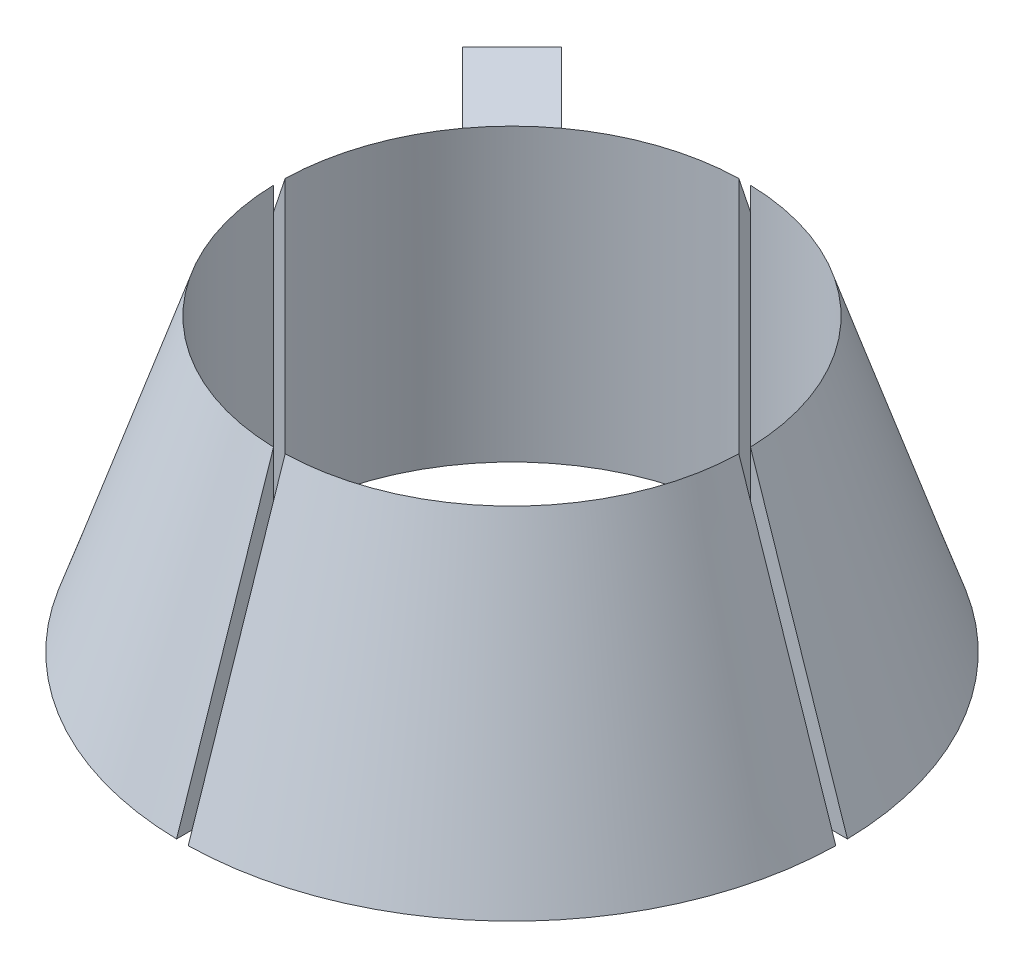
ISO-10303-21;
HEADER;
FILE_DESCRIPTION(('STEP AP214'),'2;1');
FILE_NAME('part.step','',(''),(''),'','','');
FILE_SCHEMA(('AUTOMOTIVE_DESIGN { 1 0 10303 214 1 1 1 1 }'));
ENDSEC;
DATA;
#1=APPLICATION_CONTEXT('core data for automotive mechanical design processes');
#2=APPLICATION_PROTOCOL_DEFINITION('international standard','automotive_design',2000,#1);
#3=PRODUCT_CONTEXT('',#1,'mechanical');
#4=PRODUCT('Part','Part','',(#3));
#5=PRODUCT_RELATED_PRODUCT_CATEGORY('part','',(#4));
#6=PRODUCT_DEFINITION_FORMATION('','',#4);
#7=PRODUCT_DEFINITION_CONTEXT('part definition',#1,'design');
#8=PRODUCT_DEFINITION('design','',#6,#7);
#9=PRODUCT_DEFINITION_SHAPE('','',#8);
#10=(LENGTH_UNIT() NAMED_UNIT(*) SI_UNIT(.MILLI.,.METRE.));
#11=(NAMED_UNIT(*) PLANE_ANGLE_UNIT() SI_UNIT($,.RADIAN.));
#12=(NAMED_UNIT(*) SI_UNIT($,.STERADIAN.) SOLID_ANGLE_UNIT());
#13=UNCERTAINTY_MEASURE_WITH_UNIT(LENGTH_MEASURE(1.E-05),#10,'distance_accuracy_value','');
#14=(GEOMETRIC_REPRESENTATION_CONTEXT(3) GLOBAL_UNCERTAINTY_ASSIGNED_CONTEXT((#13)) GLOBAL_UNIT_ASSIGNED_CONTEXT((#10,
#11,#12)) REPRESENTATION_CONTEXT('',''));
#15=CARTESIAN_POINT('',(0.,0.,0.));
#16=DIRECTION('',(0.,0.,1.));
#17=DIRECTION('',(1.,0.,0.));
#18=AXIS2_PLACEMENT_3D('',#15,#16,#17);
#19=CARTESIAN_POINT('',(0.,0.,0.));
#20=DIRECTION('',(0.,-1.,0.));
#21=DIRECTION('',(0.,0.,-1.));
#22=AXIS2_PLACEMENT_3D('',#19,#20,#21);
#23=CONICAL_SURFACE('',#22,85.,0.321750554396642);
#24=CARTESIAN_POINT('',(111.344254560153,-79.0630737031647,-1.5));
#25=CARTESIAN_POINT('',(106.885014199921,-65.6865833870292,-1.5));
#26=CARTESIAN_POINT('',(102.425739625897,-52.3101044759694,-1.5));
#27=CARTESIAN_POINT('',(93.5070595824175,-25.5571902857401,-1.5));
#28=CARTESIAN_POINT('',(89.0476541129616,-12.1807550065706,-1.5));
#29=CARTESIAN_POINT('',(80.1286498380599,14.5720510162729,-1.5));
#30=CARTESIAN_POINT('',(75.6690510326151,27.9484217599474,-1.5));
#31=CARTESIAN_POINT('',(66.7495297706178,54.7010553410361,-1.5));
#32=CARTESIAN_POINT('',(62.2896073140653,68.0773181784502,-1.5));
#33=CARTESIAN_POINT('',(53.7940700014018,93.5553747355309,-1.5));
#34=CARTESIAN_POINT('',(49.7585088777578,105.657186371305,-1.5));
#35=CARTESIAN_POINT('',(43.7044308667674,123.809658276854,-1.5));
#36=CARTESIAN_POINT('',(41.6862821396155,129.860441328381,-1.5));
#37=CARTESIAN_POINT('',(37.6495793829015,141.9618722447,-1.5));
#38=CARTESIAN_POINT('',(35.6310253533386,148.01252010949,-1.5));
#39=CARTESIAN_POINT('',(33.6121887453094,154.063073703165,-1.5));
#40=B_SPLINE_CURVE_WITH_KNOTS('',3,(#24,#25,#26,#27,#28,#29,#30,#31,#32,#33,#34,#35,#36,#37,#38,
#39),.UNSPECIFIED.,.F.,.F.,(4,2,2,2,2,2,2,4),(0.,42.300565716967,84.6011314485389,
126.901696950434,169.202262453395,207.473091870884,226.608506628311,245.743921422518),.UNSPECIFIED.);
#41=CARTESIAN_POINT('',(84.9867636752924,0.,-1.5));
#42=VERTEX_POINT('',#41);
#43=CARTESIAN_POINT('',(59.9812470693966,75.,-1.5));
#44=VERTEX_POINT('',#43);
#45=EDGE_CURVE('E94',#42,#44,#40,.T.);
#46=ORIENTED_EDGE('',*,*,#45,.F.);
#47=CARTESIAN_POINT('',(0.,0.,0.));
#48=DIRECTION('',(0.,-1.,0.));
#49=DIRECTION('',(0.,0.,-1.));
#50=AXIS2_PLACEMENT_3D('',#47,#48,#49);
#51=CIRCLE('',#50,85.);
#52=CARTESIAN_POINT('',(1.5,0.,-84.9867636752924));
#53=VERTEX_POINT('',#52);
#54=EDGE_CURVE('E103',#53,#42,#51,.T.);
#55=ORIENTED_EDGE('',*,*,#54,.F.);
#56=CARTESIAN_POINT('',(1.5,154.063073703165,-33.6121887453094));
#57=CARTESIAN_POINT('',(1.5,150.02173993849,-34.960635164649));
#58=CARTESIAN_POINT('',(1.5,145.980361276657,-36.3089470134455));
#59=CARTESIAN_POINT('',(1.5,137.897534290662,-39.0053618771885));
#60=CARTESIAN_POINT('',(1.5,133.8560859665,-40.3534648921353));
#61=CARTESIAN_POINT('',(1.5,121.731666703561,-44.3975511453717));
#62=CARTESIAN_POINT('',(1.5,113.648621456313,-47.0933115980679));
#63=CARTESIAN_POINT('',(1.5,90.1801908456613,-54.9196764609891));
#64=CARTESIAN_POINT('',(1.5,74.7946577102604,-60.0498377420316));
#65=CARTESIAN_POINT('',(1.5,44.0234124546394,-70.3096235049857));
#66=CARTESIAN_POINT('',(1.5,28.6377003344192,-75.4392479868969));
#67=CARTESIAN_POINT('',(1.5,-2.13382239494428,-85.6982019838512));
#68=CARTESIAN_POINT('',(1.49999999999999,-17.5196330040885,-90.8275314988918));
#69=CARTESIAN_POINT('',(1.49999999999999,-48.291316075304,-101.086004900449));
#70=CARTESIAN_POINT('',(1.49999999999999,-63.6771885373753,-106.215148786967));
#71=CARTESIAN_POINT('',(1.49999999999999,-79.0630737031648,-111.344254560153));
#72=B_SPLINE_CURVE_WITH_KNOTS('',3,(#56,#57,#58,#59,#60,#61,#62,#63,#64,#65,#66,#67,#68,#69,#70,
#71),.UNSPECIFIED.,.F.,.F.,(4,2,2,2,2,2,2,4),(0.,12.7810866863693,25.5621733590717,
51.1243466474992,99.7792401222359,148.434133634972,197.089027573664,245.743921424112),.UNSPECIFIED.);
#73=CARTESIAN_POINT('',(1.5,75.,-59.9812470693966));
#74=VERTEX_POINT('',#73);
#75=EDGE_CURVE('E89',#74,#53,#72,.T.);
#76=ORIENTED_EDGE('',*,*,#75,.F.);
#77=CARTESIAN_POINT('',(0.,75.,0.));
#78=DIRECTION('',(0.,-1.,0.));
#79=DIRECTION('',(0.,0.,-1.));
#80=AXIS2_PLACEMENT_3D('',#77,#78,#79);
#81=CIRCLE('',#80,60.);
#82=EDGE_CURVE('E102',#74,#44,#81,.T.);
#83=ORIENTED_EDGE('',*,*,#82,.T.);
#84=EDGE_LOOP('',(#46,#55,#76,#83));
#85=FACE_BOUND('',#84,.T.);
#86=ADVANCED_FACE('F54',(#85),#23,.T.);
#87=CARTESIAN_POINT('',(60.,0.,0.));
#88=DIRECTION('',(0.,-1.,0.));
#89=DIRECTION('',(0.,0.,-1.));
#90=AXIS2_PLACEMENT_3D('',#87,#88,#89);
#91=PLANE('',#90);
#92=DIRECTION('',(1.,0.,0.));
#93=VECTOR('',#92,1.);
#94=CARTESIAN_POINT('',(59.9812470693966,0.,-1.5));
#95=LINE('',#94,#93);
#96=CARTESIAN_POINT('',(59.9812470693966,0.,-1.5));
#97=VERTEX_POINT('',#96);
#98=EDGE_CURVE('E12',#97,#42,#95,.T.);
#99=ORIENTED_EDGE('',*,*,#98,.F.);
#100=CARTESIAN_POINT('',(0.,0.,0.));
#101=DIRECTION('',(0.,-1.,0.));
#102=DIRECTION('',(0.,0.,-1.));
#103=AXIS2_PLACEMENT_3D('',#100,#101,#102);
#104=CIRCLE('',#103,60.);
#105=CARTESIAN_POINT('',(1.49999999999945,0.,-59.9812470693966));
#106=VERTEX_POINT('',#105);
#107=EDGE_CURVE('E58',#106,#97,#104,.T.);
#108=ORIENTED_EDGE('',*,*,#107,.F.);
#109=DIRECTION('',(0.,0.,1.));
#110=VECTOR('',#109,1.);
#111=CARTESIAN_POINT('',(1.5,0.,-59.9812470693966));
#112=LINE('',#111,#110);
#113=EDGE_CURVE('E87',#53,#106,#112,.T.);
#114=ORIENTED_EDGE('',*,*,#113,.F.);
#115=ORIENTED_EDGE('',*,*,#54,.T.);
#116=EDGE_LOOP('',(#99,#108,#114,#115));
#117=FACE_BOUND('',#116,.T.);
#118=ADVANCED_FACE('F105',(#117),#91,.T.);
#119=CARTESIAN_POINT('',(0.,0.,0.));
#120=DIRECTION('',(0.,-1.,0.));
#121=DIRECTION('',(0.,0.,-1.));
#122=AXIS2_PLACEMENT_3D('',#119,#120,#121);
#123=CYLINDRICAL_SURFACE('',#122,60.);
#124=DIRECTION('',(0.,-1.,0.));
#125=VECTOR('',#124,1.);
#126=CARTESIAN_POINT('',(59.9812470693966,75.,-1.5));
#127=LINE('',#126,#125);
#128=EDGE_CURVE('E64',#44,#97,#127,.T.);
#129=ORIENTED_EDGE('',*,*,#128,.F.);
#130=ORIENTED_EDGE('',*,*,#82,.F.);
#131=DIRECTION('',(0.,-1.,0.));
#132=VECTOR('',#131,1.);
#133=CARTESIAN_POINT('',(1.5,75.,-59.9812470693966));
#134=LINE('',#133,#132);
#135=EDGE_CURVE('E84',#74,#106,#134,.T.);
#136=ORIENTED_EDGE('',*,*,#135,.T.);
#137=ORIENTED_EDGE('',*,*,#107,.T.);
#138=EDGE_LOOP('',(#129,#130,#136,#137));
#139=FACE_BOUND('',#138,.T.);
#140=ADVANCED_FACE('F100',(#139),#123,.F.);
#141=CARTESIAN_POINT('',(1.5,75.,-59.9812470693966));
#142=DIRECTION('',(1.,0.,0.));
#143=DIRECTION('',(0.,0.,-1.));
#144=AXIS2_PLACEMENT_3D('',#141,#142,#143);
#145=PLANE('',#144);
#146=ORIENTED_EDGE('',*,*,#75,.T.);
#147=ORIENTED_EDGE('',*,*,#113,.T.);
#148=ORIENTED_EDGE('',*,*,#135,.F.);
#149=EDGE_LOOP('',(#146,#147,#148));
#150=FACE_BOUND('',#149,.T.);
#151=ADVANCED_FACE('F88',(#150),#145,.F.);
#152=CARTESIAN_POINT('',(59.9812470693966,75.,-1.5));
#153=DIRECTION('',(0.,0.,-1.));
#154=DIRECTION('',(-1.,0.,0.));
#155=AXIS2_PLACEMENT_3D('',#152,#153,#154);
#156=PLANE('',#155);
#157=ORIENTED_EDGE('',*,*,#45,.T.);
#158=ORIENTED_EDGE('',*,*,#128,.T.);
#159=ORIENTED_EDGE('',*,*,#98,.T.);
#160=EDGE_LOOP('',(#157,#158,#159));
#161=FACE_BOUND('',#160,.T.);
#162=ADVANCED_FACE('F120',(#161),#156,.F.);
#163=CLOSED_SHELL('',(#86,#118,#140,#151,#162));
#164=MANIFOLD_SOLID_BREP('B2',#163);
#165=CARTESIAN_POINT('',(0.,0.,0.));
#166=DIRECTION('',(0.,-1.,0.));
#167=DIRECTION('',(0.,0.,-1.));
#168=AXIS2_PLACEMENT_3D('',#165,#166,#167);
#169=CYLINDRICAL_SURFACE('',#168,60.);
#170=DIRECTION('',(0.,-1.,0.));
#171=VECTOR('',#170,1.);
#172=CARTESIAN_POINT('',(-59.9812470693966,75.,1.49999999999999));
#173=LINE('',#172,#171);
#174=CARTESIAN_POINT('',(-59.9812470693966,75.,1.49999999999999));
#175=VERTEX_POINT('',#174);
#176=CARTESIAN_POINT('',(-59.9812470693966,0.,1.49999999999999));
#177=VERTEX_POINT('',#176);
#178=EDGE_CURVE('E185',#175,#177,#173,.T.);
#179=ORIENTED_EDGE('',*,*,#178,.F.);
#180=CARTESIAN_POINT('',(0.,75.,0.));
#181=DIRECTION('',(0.,-1.,0.));
#182=DIRECTION('',(0.,0.,-1.));
#183=AXIS2_PLACEMENT_3D('',#180,#181,#182);
#184=CIRCLE('',#183,60.);
#185=CARTESIAN_POINT('',(-1.50000000000001,75.,59.9812470693966));
#186=VERTEX_POINT('',#185);
#187=EDGE_CURVE('E222',#186,#175,#184,.T.);
#188=ORIENTED_EDGE('',*,*,#187,.F.);
#189=DIRECTION('',(0.,-1.,0.));
#190=VECTOR('',#189,1.);
#191=CARTESIAN_POINT('',(-1.50000000000001,75.,59.9812470693966));
#192=LINE('',#191,#190);
#193=CARTESIAN_POINT('',(-1.49999999999974,0.,59.9812470693966));
#194=VERTEX_POINT('',#193);
#195=EDGE_CURVE('E205',#186,#194,#192,.T.);
#196=ORIENTED_EDGE('',*,*,#195,.T.);
#197=CARTESIAN_POINT('',(0.,0.,0.));
#198=DIRECTION('',(0.,-1.,0.));
#199=DIRECTION('',(0.,0.,-1.));
#200=AXIS2_PLACEMENT_3D('',#197,#198,#199);
#201=CIRCLE('',#200,60.);
#202=EDGE_CURVE('E179',#194,#177,#201,.T.);
#203=ORIENTED_EDGE('',*,*,#202,.T.);
#204=EDGE_LOOP('',(#179,#188,#196,#203));
#205=FACE_BOUND('',#204,.T.);
#206=ADVANCED_FACE('F174',(#205),#169,.F.);
#207=CARTESIAN_POINT('',(60.,0.,0.));
#208=DIRECTION('',(0.,-1.,0.));
#209=DIRECTION('',(0.,0.,-1.));
#210=AXIS2_PLACEMENT_3D('',#207,#208,#209);
#211=PLANE('',#210);
#212=DIRECTION('',(-1.,0.,0.));
#213=VECTOR('',#212,1.);
#214=CARTESIAN_POINT('',(-59.9812470693966,0.,1.49999999999999));
#215=LINE('',#214,#213);
#216=CARTESIAN_POINT('',(-84.9867636752924,0.,1.49999999999999));
#217=VERTEX_POINT('',#216);
#218=EDGE_CURVE('E52',#177,#217,#215,.T.);
#219=ORIENTED_EDGE('',*,*,#218,.F.);
#220=ORIENTED_EDGE('',*,*,#202,.F.);
#221=DIRECTION('',(0.,0.,-1.));
#222=VECTOR('',#221,1.);
#223=CARTESIAN_POINT('',(-1.50000000000001,0.,59.9812470693966));
#224=LINE('',#223,#222);
#225=CARTESIAN_POINT('',(-1.50000000000002,0.,84.9867636752924));
#226=VERTEX_POINT('',#225);
#227=EDGE_CURVE('E208',#226,#194,#224,.T.);
#228=ORIENTED_EDGE('',*,*,#227,.F.);
#229=CARTESIAN_POINT('',(0.,0.,0.));
#230=DIRECTION('',(0.,-1.,0.));
#231=DIRECTION('',(0.,0.,-1.));
#232=AXIS2_PLACEMENT_3D('',#229,#230,#231);
#233=CIRCLE('',#232,85.);
#234=EDGE_CURVE('E225',#226,#217,#233,.T.);
#235=ORIENTED_EDGE('',*,*,#234,.T.);
#236=EDGE_LOOP('',(#219,#220,#228,#235));
#237=FACE_BOUND('',#236,.T.);
#238=ADVANCED_FACE('F224',(#237),#211,.T.);
#239=CARTESIAN_POINT('',(0.,0.,0.));
#240=DIRECTION('',(0.,-1.,0.));
#241=DIRECTION('',(0.,0.,-1.));
#242=AXIS2_PLACEMENT_3D('',#239,#240,#241);
#243=CONICAL_SURFACE('',#242,85.,0.321750554396642);
#244=CARTESIAN_POINT('',(-111.344254560153,-79.0630737031647,1.49999999999999));
#245=CARTESIAN_POINT('',(-106.885014199921,-65.6865833870292,1.49999999999999));
#246=CARTESIAN_POINT('',(-102.425739625897,-52.3101044759694,1.49999999999999));
#247=CARTESIAN_POINT('',(-93.5070595824175,-25.5571902857401,1.49999999999999));
#248=CARTESIAN_POINT('',(-89.0476541129616,-12.1807550065706,1.49999999999999));
#249=CARTESIAN_POINT('',(-80.1286498380599,14.5720510162729,1.49999999999999));
#250=CARTESIAN_POINT('',(-75.6690510326151,27.9484217599474,1.49999999999999));
#251=CARTESIAN_POINT('',(-66.7495297706178,54.7010553410361,1.49999999999999));
#252=CARTESIAN_POINT('',(-62.2896073140653,68.0773181784502,1.49999999999999));
#253=CARTESIAN_POINT('',(-53.7940700014018,93.5553747355309,1.49999999999999));
#254=CARTESIAN_POINT('',(-49.7585088777578,105.657186371305,1.49999999999999));
#255=CARTESIAN_POINT('',(-43.7044308667674,123.809658276854,1.49999999999999));
#256=CARTESIAN_POINT('',(-41.6862821396155,129.860441328381,1.49999999999999));
#257=CARTESIAN_POINT('',(-37.6495793829015,141.9618722447,1.5));
#258=CARTESIAN_POINT('',(-35.6310253533386,148.01252010949,1.5));
#259=CARTESIAN_POINT('',(-33.6121887453094,154.063073703165,1.5));
#260=B_SPLINE_CURVE_WITH_KNOTS('',3,(#244,#245,#246,#247,#248,#249,#250,#251,#252,#253,#254,
#255,#256,#257,#258,#259),.UNSPECIFIED.,.F.,.F.,(4,2,2,2,2,2,2,4),(0.,42.300565716967,
84.6011314485389,126.901696950434,169.202262453395,207.473091870884,226.608506628311,
245.743921422518),.UNSPECIFIED.);
#261=EDGE_CURVE('E215',#217,#175,#260,.T.);
#262=ORIENTED_EDGE('',*,*,#261,.F.);
#263=ORIENTED_EDGE('',*,*,#234,.F.);
#264=CARTESIAN_POINT('',(-1.50000000000001,154.063073703165,33.6121887453094));
#265=CARTESIAN_POINT('',(-1.50000000000001,150.02173993849,34.960635164649));
#266=CARTESIAN_POINT('',(-1.50000000000001,145.980361276657,36.3089470134454));
#267=CARTESIAN_POINT('',(-1.50000000000001,137.897534290662,39.0053618771885));
#268=CARTESIAN_POINT('',(-1.50000000000001,133.8560859665,40.3534648921353));
#269=CARTESIAN_POINT('',(-1.50000000000001,121.731666703561,44.3975511453717));
#270=CARTESIAN_POINT('',(-1.50000000000001,113.648621456313,47.0933115980679));
#271=CARTESIAN_POINT('',(-1.50000000000001,90.1801908456614,54.9196764609891));
#272=CARTESIAN_POINT('',(-1.50000000000001,74.7946577102604,60.0498377420316));
#273=CARTESIAN_POINT('',(-1.50000000000001,44.0234124546394,70.3096235049857));
#274=CARTESIAN_POINT('',(-1.50000000000001,28.6377003344193,75.4392479868969));
#275=CARTESIAN_POINT('',(-1.50000000000002,-2.13382239494426,85.6982019838512));
#276=CARTESIAN_POINT('',(-1.50000000000002,-17.5196330040885,90.8275314988918));
#277=CARTESIAN_POINT('',(-1.50000000000002,-48.291316075304,101.086004900449));
#278=CARTESIAN_POINT('',(-1.50000000000002,-63.6771885373753,106.215148786967));
#279=CARTESIAN_POINT('',(-1.50000000000002,-79.0630737031648,111.344254560153));
#280=B_SPLINE_CURVE_WITH_KNOTS('',3,(#264,#265,#266,#267,#268,#269,#270,#271,#272,#273,#274,
#275,#276,#277,#278,#279),.UNSPECIFIED.,.F.,.F.,(4,2,2,2,2,2,2,4),(0.,12.7810866863693,
25.5621733590717,51.1243466474991,99.7792401222359,148.434133634972,197.089027573664,
245.743921424112),.UNSPECIFIED.);
#281=EDGE_CURVE('E210',#186,#226,#280,.T.);
#282=ORIENTED_EDGE('',*,*,#281,.F.);
#283=ORIENTED_EDGE('',*,*,#187,.T.);
#284=EDGE_LOOP('',(#262,#263,#282,#283));
#285=FACE_BOUND('',#284,.T.);
#286=ADVANCED_FACE('F176',(#285),#243,.T.);
#287=CARTESIAN_POINT('',(-1.50000000000001,75.,59.9812470693966));
#288=DIRECTION('',(-1.,0.,0.));
#289=DIRECTION('',(0.,0.,1.));
#290=AXIS2_PLACEMENT_3D('',#287,#288,#289);
#291=PLANE('',#290);
#292=ORIENTED_EDGE('',*,*,#281,.T.);
#293=ORIENTED_EDGE('',*,*,#227,.T.);
#294=ORIENTED_EDGE('',*,*,#195,.F.);
#295=EDGE_LOOP('',(#292,#293,#294));
#296=FACE_BOUND('',#295,.T.);
#297=ADVANCED_FACE('F209',(#296),#291,.F.);
#298=CARTESIAN_POINT('',(-59.9812470693966,75.,1.49999999999999));
#299=DIRECTION('',(0.,0.,1.));
#300=DIRECTION('',(1.,0.,0.));
#301=AXIS2_PLACEMENT_3D('',#298,#299,#300);
#302=PLANE('',#301);
#303=ORIENTED_EDGE('',*,*,#261,.T.);
#304=ORIENTED_EDGE('',*,*,#178,.T.);
#305=ORIENTED_EDGE('',*,*,#218,.T.);
#306=EDGE_LOOP('',(#303,#304,#305));
#307=FACE_BOUND('',#306,.T.);
#308=ADVANCED_FACE('F242',(#307),#302,.F.);
#309=CLOSED_SHELL('',(#206,#238,#286,#297,#308));
#310=MANIFOLD_SOLID_BREP('B6',#309);
#311=CARTESIAN_POINT('',(0.,0.,0.));
#312=DIRECTION('',(0.,-1.,0.));
#313=DIRECTION('',(0.,0.,-1.));
#314=AXIS2_PLACEMENT_3D('',#311,#312,#313);
#315=CYLINDRICAL_SURFACE('',#314,60.);
#316=DIRECTION('',(0.,-1.,0.));
#317=VECTOR('',#316,1.);
#318=CARTESIAN_POINT('',(59.9812470693966,75.,1.5));
#319=LINE('',#318,#317);
#320=CARTESIAN_POINT('',(59.9812470693966,75.,1.5));
#321=VERTEX_POINT('',#320);
#322=CARTESIAN_POINT('',(59.9812470693966,0.,1.49999999999974));
#323=VERTEX_POINT('',#322);
#324=EDGE_CURVE('E310',#321,#323,#319,.T.);
#325=ORIENTED_EDGE('',*,*,#324,.T.);
#326=CARTESIAN_POINT('',(0.,0.,0.));
#327=DIRECTION('',(0.,-1.,0.));
#328=DIRECTION('',(0.,0.,-1.));
#329=AXIS2_PLACEMENT_3D('',#326,#327,#328);
#330=CIRCLE('',#329,60.);
#331=CARTESIAN_POINT('',(1.49999999999999,0.,59.9812470693966));
#332=VERTEX_POINT('',#331);
#333=EDGE_CURVE('E298',#323,#332,#330,.T.);
#334=ORIENTED_EDGE('',*,*,#333,.T.);
#335=DIRECTION('',(0.,-1.,0.));
#336=VECTOR('',#335,1.);
#337=CARTESIAN_POINT('',(1.49999999999999,75.,59.9812470693966));
#338=LINE('',#337,#336);
#339=CARTESIAN_POINT('',(1.49999999999999,75.,59.9812470693966));
#340=VERTEX_POINT('',#339);
#341=EDGE_CURVE('E326',#340,#332,#338,.T.);
#342=ORIENTED_EDGE('',*,*,#341,.F.);
#343=CARTESIAN_POINT('',(0.,75.,0.));
#344=DIRECTION('',(0.,-1.,0.));
#345=DIRECTION('',(0.,0.,-1.));
#346=AXIS2_PLACEMENT_3D('',#343,#344,#345);
#347=CIRCLE('',#346,60.);
#348=EDGE_CURVE('E336',#321,#340,#347,.T.);
#349=ORIENTED_EDGE('',*,*,#348,.F.);
#350=EDGE_LOOP('',(#325,#334,#342,#349));
#351=FACE_BOUND('',#350,.T.);
#352=ADVANCED_FACE('F293',(#351),#315,.F.);
#353=CARTESIAN_POINT('',(60.,0.,0.));
#354=DIRECTION('',(0.,-1.,0.));
#355=DIRECTION('',(0.,0.,-1.));
#356=AXIS2_PLACEMENT_3D('',#353,#354,#355);
#357=PLANE('',#356);
#358=DIRECTION('',(-1.,0.,0.));
#359=VECTOR('',#358,1.);
#360=CARTESIAN_POINT('',(59.9812470693966,0.,1.5));
#361=LINE('',#360,#359);
#362=CARTESIAN_POINT('',(84.9867636752924,0.,1.5));
#363=VERTEX_POINT('',#362);
#364=EDGE_CURVE('E172',#363,#323,#361,.T.);
#365=ORIENTED_EDGE('',*,*,#364,.F.);
#366=CARTESIAN_POINT('',(0.,0.,0.));
#367=DIRECTION('',(0.,-1.,0.));
#368=DIRECTION('',(0.,0.,-1.));
#369=AXIS2_PLACEMENT_3D('',#366,#367,#368);
#370=CIRCLE('',#369,85.);
#371=CARTESIAN_POINT('',(1.49999999999998,0.,84.9867636752924));
#372=VERTEX_POINT('',#371);
#373=EDGE_CURVE('E343',#363,#372,#370,.T.);
#374=ORIENTED_EDGE('',*,*,#373,.T.);
#375=DIRECTION('',(0.,0.,1.));
#376=VECTOR('',#375,1.);
#377=CARTESIAN_POINT('',(1.49999999999999,0.,59.9812470693966));
#378=LINE('',#377,#376);
#379=EDGE_CURVE('E331',#332,#372,#378,.T.);
#380=ORIENTED_EDGE('',*,*,#379,.F.);
#381=ORIENTED_EDGE('',*,*,#333,.F.);
#382=EDGE_LOOP('',(#365,#374,#380,#381));
#383=FACE_BOUND('',#382,.T.);
#384=ADVANCED_FACE('F365',(#383),#357,.T.);
#385=CARTESIAN_POINT('',(0.,0.,0.));
#386=DIRECTION('',(0.,-1.,0.));
#387=DIRECTION('',(0.,0.,-1.));
#388=AXIS2_PLACEMENT_3D('',#385,#386,#387);
#389=CONICAL_SURFACE('',#388,85.,0.321750554396642);
#390=CARTESIAN_POINT('',(33.6121887453094,154.063073703165,1.5));
#391=CARTESIAN_POINT('',(34.960635164649,150.02173993849,1.5));
#392=CARTESIAN_POINT('',(36.3089470134454,145.980361276657,1.5));
#393=CARTESIAN_POINT('',(39.0053618771885,137.897534290662,1.5));
#394=CARTESIAN_POINT('',(40.3534648921353,133.8560859665,1.5));
#395=CARTESIAN_POINT('',(44.3975511453717,121.731666703561,1.5));
#396=CARTESIAN_POINT('',(47.0933115980679,113.648621456313,1.5));
#397=CARTESIAN_POINT('',(54.9196764609891,90.1801908456614,1.5));
#398=CARTESIAN_POINT('',(60.0498377420316,74.7946577102604,1.5));
#399=CARTESIAN_POINT('',(70.3096235049857,44.0234124546394,1.5));
#400=CARTESIAN_POINT('',(75.4392479868969,28.6377003344193,1.5));
#401=CARTESIAN_POINT('',(85.6982019838512,-2.13382239494426,1.5));
#402=CARTESIAN_POINT('',(90.8275314988918,-17.5196330040885,1.5));
#403=CARTESIAN_POINT('',(101.086004900449,-48.291316075304,1.5));
#404=CARTESIAN_POINT('',(106.215148786967,-63.6771885373753,1.5));
#405=CARTESIAN_POINT('',(111.344254560153,-79.0630737031648,1.5));
#406=B_SPLINE_CURVE_WITH_KNOTS('',3,(#390,#391,#392,#393,#394,#395,#396,#397,#398,#399,#400,
#401,#402,#403,#404,#405),.UNSPECIFIED.,.F.,.F.,(4,2,2,2,2,2,2,4),(0.,12.7810866863693,
25.5621733590717,51.1243466474991,99.7792401222359,148.434133634972,197.089027573664,
245.743921424112),.UNSPECIFIED.);
#407=EDGE_CURVE('E303',#321,#363,#406,.T.);
#408=ORIENTED_EDGE('',*,*,#407,.F.);
#409=ORIENTED_EDGE('',*,*,#348,.T.);
#410=CARTESIAN_POINT('',(1.49999999999998,-79.0630737031647,111.344254560153));
#411=CARTESIAN_POINT('',(1.49999999999998,-65.6865833870292,106.885014199921));
#412=CARTESIAN_POINT('',(1.49999999999998,-52.3101044759694,102.425739625897));
#413=CARTESIAN_POINT('',(1.49999999999998,-25.5571902857401,93.5070595824175));
#414=CARTESIAN_POINT('',(1.49999999999998,-12.1807550065706,89.0476541129616));
#415=CARTESIAN_POINT('',(1.49999999999999,14.5720510162729,80.1286498380599));
#416=CARTESIAN_POINT('',(1.49999999999999,27.9484217599474,75.6690510326151));
#417=CARTESIAN_POINT('',(1.49999999999999,54.7010553410361,66.7495297706178));
#418=CARTESIAN_POINT('',(1.49999999999999,68.0773181784502,62.2896073140653));
#419=CARTESIAN_POINT('',(1.49999999999999,93.5553747355309,53.7940700014018));
#420=CARTESIAN_POINT('',(1.49999999999999,105.657186371305,49.7585088777578));
#421=CARTESIAN_POINT('',(1.49999999999999,123.809658276854,43.7044308667674));
#422=CARTESIAN_POINT('',(1.49999999999999,129.860441328381,41.6862821396155));
#423=CARTESIAN_POINT('',(1.49999999999999,141.9618722447,37.6495793829015));
#424=CARTESIAN_POINT('',(1.49999999999999,148.01252010949,35.6310253533386));
#425=CARTESIAN_POINT('',(1.49999999999999,154.063073703165,33.6121887453094));
#426=B_SPLINE_CURVE_WITH_KNOTS('',3,(#410,#411,#412,#413,#414,#415,#416,#417,#418,#419,#420,
#421,#422,#423,#424,#425),.UNSPECIFIED.,.F.,.F.,(4,2,2,2,2,2,2,4),(0.,42.300565716967,
84.6011314485389,126.901696950434,169.202262453395,207.473091870884,226.608506628311,
245.743921422518),.UNSPECIFIED.);
#427=EDGE_CURVE('E329',#372,#340,#426,.T.);
#428=ORIENTED_EDGE('',*,*,#427,.F.);
#429=ORIENTED_EDGE('',*,*,#373,.F.);
#430=EDGE_LOOP('',(#408,#409,#428,#429));
#431=FACE_BOUND('',#430,.T.);
#432=ADVANCED_FACE('F295',(#431),#389,.T.);
#433=CARTESIAN_POINT('',(1.49999999999999,75.,59.9812470693966));
#434=DIRECTION('',(1.,0.,0.));
#435=DIRECTION('',(0.,0.,-1.));
#436=AXIS2_PLACEMENT_3D('',#433,#434,#435);
#437=PLANE('',#436);
#438=ORIENTED_EDGE('',*,*,#427,.T.);
#439=ORIENTED_EDGE('',*,*,#341,.T.);
#440=ORIENTED_EDGE('',*,*,#379,.T.);
#441=EDGE_LOOP('',(#438,#439,#440));
#442=FACE_BOUND('',#441,.T.);
#443=ADVANCED_FACE('F330',(#442),#437,.F.);
#444=CARTESIAN_POINT('',(59.9812470693966,75.,1.5));
#445=DIRECTION('',(0.,0.,1.));
#446=DIRECTION('',(1.,0.,0.));
#447=AXIS2_PLACEMENT_3D('',#444,#445,#446);
#448=PLANE('',#447);
#449=ORIENTED_EDGE('',*,*,#407,.T.);
#450=ORIENTED_EDGE('',*,*,#364,.T.);
#451=ORIENTED_EDGE('',*,*,#324,.F.);
#452=EDGE_LOOP('',(#449,#450,#451));
#453=FACE_BOUND('',#452,.T.);
#454=ADVANCED_FACE('F360',(#453),#448,.F.);
#455=CLOSED_SHELL('',(#352,#384,#432,#443,#454));
#456=MANIFOLD_SOLID_BREP('B46',#455);
#457=CARTESIAN_POINT('',(0.,0.,0.));
#458=DIRECTION('',(0.,-1.,0.));
#459=DIRECTION('',(0.,0.,-1.));
#460=AXIS2_PLACEMENT_3D('',#457,#458,#459);
#461=CONICAL_SURFACE('',#460,85.,0.321750554396642);
#462=CARTESIAN_POINT('',(-35.5823856517465,75.0002,-48.3103077131044));
#463=CARTESIAN_POINT('',(-36.3271296216718,71.8762522081956,-49.0550516830297));
#464=CARTESIAN_POINT('',(-37.0714797646763,68.752116706072,-49.7994018260342));
#465=CARTESIAN_POINT('',(-38.5594920139606,62.5035180932109,-51.2874140753185));
#466=CARTESIAN_POINT('',(-39.3031541202584,59.3790549824818,-52.0310761816163));
#467=CARTESIAN_POINT('',(-41.5332576026338,50.0052468263744,-54.2611796639917));
#468=CARTESIAN_POINT('',(-43.0188164083267,43.755481840403,-55.7467384696846));
#469=CARTESIAN_POINT('',(-45.9881534176978,31.2551066883831,-58.7160754790557));
#470=CARTESIAN_POINT('',(-47.4719316215254,25.0044965224054,-60.1998536828832));
#471=CARTESIAN_POINT('',(-50.4380788179956,12.5026062348722,-63.1660008793535));
#472=CARTESIAN_POINT('',(-51.9204478103875,6.25132611319756,-64.6483698717454));
#473=CARTESIAN_POINT('',(-53.402297566199,-0.000200000000019504,-66.1302196275569));
#474=B_SPLINE_CURVE_WITH_KNOTS('',3,(#462,#463,#464,#465,#466,#467,#468,#469,#470,#471,#472,
#473),.UNSPECIFIED.,.F.,.F.,(4,2,2,2,2,4),(0.,9.89014811846057,19.7802959774212,
39.5605881601617,59.3408786836875,79.121172726052),.UNSPECIFIED.);
#475=CARTESIAN_POINT('',(-35.5824333316497,75.,-48.3103553930076));
#476=VERTEX_POINT('',#475);
#477=CARTESIAN_POINT('',(-53.4022501592568,0.,-66.1301722206147));
#478=VERTEX_POINT('',#477);
#479=EDGE_CURVE('E291',#476,#478,#474,.T.);
#480=ORIENTED_EDGE('',*,*,#479,.F.);
#481=CARTESIAN_POINT('',(0.,75.,0.));
#482=DIRECTION('',(0.,-1.,0.));
#483=DIRECTION('',(0.,0.,-1.));
#484=AXIS2_PLACEMENT_3D('',#481,#482,#483);
#485=CIRCLE('',#484,60.);
#486=CARTESIAN_POINT('',(-1.49999999999945,75.,-59.9812470693966));
#487=VERTEX_POINT('',#486);
#488=EDGE_CURVE('E424',#476,#487,#485,.T.);
#489=ORIENTED_EDGE('',*,*,#488,.T.);
#490=CARTESIAN_POINT('',(-1.49999999999999,-79.0630737031647,-111.344254560153));
#491=CARTESIAN_POINT('',(-1.49999999999999,-65.6865833870292,-106.885014199921));
#492=CARTESIAN_POINT('',(-1.49999999999999,-52.3101044759694,-102.425739625897));
#493=CARTESIAN_POINT('',(-1.49999999999999,-25.5571902857401,-93.5070595824175));
#494=CARTESIAN_POINT('',(-1.5,-12.1807550065706,-89.0476541129616));
#495=CARTESIAN_POINT('',(-1.5,14.5720510162729,-80.1286498380599));
#496=CARTESIAN_POINT('',(-1.5,27.9484217599474,-75.6690510326151));
#497=CARTESIAN_POINT('',(-1.5,54.701055341036,-66.7495297706178));
#498=CARTESIAN_POINT('',(-1.5,68.0773181784502,-62.2896073140653));
#499=CARTESIAN_POINT('',(-1.5,93.5553747355309,-53.7940700014018));
#500=CARTESIAN_POINT('',(-1.5,105.657186371305,-49.7585088777578));
#501=CARTESIAN_POINT('',(-1.5,123.809658276854,-43.7044308667674));
#502=CARTESIAN_POINT('',(-1.5,129.860441328381,-41.6862821396155));
#503=CARTESIAN_POINT('',(-1.5,141.9618722447,-37.6495793829015));
#504=CARTESIAN_POINT('',(-1.5,148.01252010949,-35.6310253533386));
#505=CARTESIAN_POINT('',(-1.5,154.063073703165,-33.6121887453094));
#506=B_SPLINE_CURVE_WITH_KNOTS('',3,(#490,#491,#492,#493,#494,#495,#496,#497,#498,#499,#500,
#501,#502,#503,#504,#505),.UNSPECIFIED.,.F.,.F.,(4,2,2,2,2,2,2,4),(0.,42.300565716967,
84.6011314485389,126.901696950434,169.202262453395,207.473091870884,226.608506628311,
245.743921422518),.UNSPECIFIED.);
#507=CARTESIAN_POINT('',(-1.5,0.,-84.9867636752924));
#508=VERTEX_POINT('',#507);
#509=EDGE_CURVE('E541',#508,#487,#506,.T.);
#510=ORIENTED_EDGE('',*,*,#509,.F.);
#511=CARTESIAN_POINT('',(0.,0.,0.));
#512=DIRECTION('',(0.,-1.,0.));
#513=DIRECTION('',(0.,0.,-1.));
#514=AXIS2_PLACEMENT_3D('',#511,#512,#513);
#515=CIRCLE('',#514,85.);
#516=EDGE_CURVE('E570',#478,#508,#515,.T.);
#517=ORIENTED_EDGE('',*,*,#516,.F.);
#518=EDGE_LOOP('',(#480,#489,#510,#517));
#519=FACE_BOUND('',#518,.T.);
#520=ADVANCED_FACE('F403',(#519),#461,.T.);
#521=CARTESIAN_POINT('',(0.,0.,0.));
#522=DIRECTION('',(0.,-1.,0.));
#523=DIRECTION('',(0.,0.,-1.));
#524=AXIS2_PLACEMENT_3D('',#521,#522,#523);
#525=CYLINDRICAL_SURFACE('',#524,60.);
#526=CARTESIAN_POINT('',(0.,0.,0.));
#527=DIRECTION('',(0.,-1.,0.));
#528=DIRECTION('',(0.,0.,-1.));
#529=AXIS2_PLACEMENT_3D('',#526,#527,#528);
#530=CIRCLE('',#529,60.);
#531=CARTESIAN_POINT('',(-59.9812470693966,0.,-1.49999999999974));
#532=VERTEX_POINT('',#531);
#533=CARTESIAN_POINT('',(-1.5,0.,-59.9812470693966));
#534=VERTEX_POINT('',#533);
#535=EDGE_CURVE('E577',#532,#534,#530,.T.);
#536=ORIENTED_EDGE('',*,*,#535,.T.);
#537=DIRECTION('',(0.,-1.,0.));
#538=VECTOR('',#537,1.);
#539=CARTESIAN_POINT('',(-1.5,75.,-59.9812470693966));
#540=LINE('',#539,#538);
#541=EDGE_CURVE('E526',#487,#534,#540,.T.);
#542=ORIENTED_EDGE('',*,*,#541,.F.);
#543=ORIENTED_EDGE('',*,*,#488,.F.);
#544=CARTESIAN_POINT('',(0.,75.,0.));
#545=DIRECTION('',(0.,1.,0.));
#546=DIRECTION('',(0.,0.,-1.));
#547=AXIS2_PLACEMENT_3D('',#544,#545,#546);
#548=CIRCLE('',#547,60.);
#549=CARTESIAN_POINT('',(-48.3103553930076,75.,-35.5824333316498));
#550=VERTEX_POINT('',#549);
#551=EDGE_CURVE('E503',#476,#550,#548,.T.);
#552=ORIENTED_EDGE('',*,*,#551,.T.);
#553=CARTESIAN_POINT('',(-59.9812470693966,75.,-1.50000000000001));
#554=VERTEX_POINT('',#553);
#555=EDGE_CURVE('E576',#554,#550,#485,.T.);
#556=ORIENTED_EDGE('',*,*,#555,.F.);
#557=DIRECTION('',(0.,-1.,0.));
#558=VECTOR('',#557,1.);
#559=CARTESIAN_POINT('',(-59.9812470693966,75.,-1.50000000000001));
#560=LINE('',#559,#558);
#561=EDGE_CURVE('E523',#554,#532,#560,.T.);
#562=ORIENTED_EDGE('',*,*,#561,.T.);
#563=EDGE_LOOP('',(#536,#542,#543,#552,#556,#562));
#564=FACE_BOUND('',#563,.T.);
#565=ADVANCED_FACE('F554',(#564),#525,.F.);
#566=CARTESIAN_POINT('',(60.,0.,0.));
#567=DIRECTION('',(0.,-1.,0.));
#568=DIRECTION('',(0.,0.,-1.));
#569=AXIS2_PLACEMENT_3D('',#566,#567,#568);
#570=PLANE('',#569);
#571=CARTESIAN_POINT('',(-84.9867636752924,0.,-1.50000000000001));
#572=VERTEX_POINT('',#571);
#573=CARTESIAN_POINT('',(-66.1301722206147,0.,-53.4022501592568));
#574=VERTEX_POINT('',#573);
#575=EDGE_CURVE('E580',#572,#574,#515,.T.);
#576=ORIENTED_EDGE('',*,*,#575,.T.);
#577=DIRECTION('',(-0.707106781186547,0.,-0.707106781186547));
#578=VECTOR('',#577,1.);
#579=CARTESIAN_POINT('',(-48.3103553930076,0.,-35.5824333316498));
#580=LINE('',#579,#578);
#581=CARTESIAN_POINT('',(-66.4680374315354,0.,-53.7401153701776));
#582=VERTEX_POINT('',#581);
#583=EDGE_CURVE('E516',#574,#582,#580,.T.);
#584=ORIENTED_EDGE('',*,*,#583,.T.);
#585=DIRECTION('',(0.707106781186547,0.,-0.707106781186547));
#586=VECTOR('',#585,1.);
#587=CARTESIAN_POINT('',(-66.4680374315354,0.,-53.7401153701776));
#588=LINE('',#587,#586);
#589=CARTESIAN_POINT('',(-53.7401153701776,0.,-66.4680374315354));
#590=VERTEX_POINT('',#589);
#591=EDGE_CURVE('E504',#582,#590,#588,.T.);
#592=ORIENTED_EDGE('',*,*,#591,.T.);
#593=DIRECTION('',(0.707106781186548,0.,0.707106781186547));
#594=VECTOR('',#593,1.);
#595=CARTESIAN_POINT('',(-53.7401153701776,0.,-66.4680374315354));
#596=LINE('',#595,#594);
#597=EDGE_CURVE('E499',#590,#478,#596,.T.);
#598=ORIENTED_EDGE('',*,*,#597,.T.);
#599=ORIENTED_EDGE('',*,*,#516,.T.);
#600=DIRECTION('',(0.,0.,-1.));
#601=VECTOR('',#600,1.);
#602=CARTESIAN_POINT('',(-1.5,0.,-59.9812470693966));
#603=LINE('',#602,#601);
#604=EDGE_CURVE('E529',#534,#508,#603,.T.);
#605=ORIENTED_EDGE('',*,*,#604,.F.);
#606=ORIENTED_EDGE('',*,*,#535,.F.);
#607=DIRECTION('',(1.,0.,0.));
#608=VECTOR('',#607,1.);
#609=CARTESIAN_POINT('',(-59.9812470693966,0.,-1.50000000000001));
#610=LINE('',#609,#608);
#611=EDGE_CURVE('E432',#572,#532,#610,.T.);
#612=ORIENTED_EDGE('',*,*,#611,.F.);
#613=EDGE_LOOP('',(#576,#584,#592,#598,#599,#605,#606,#612));
#614=FACE_BOUND('',#613,.T.);
#615=ADVANCED_FACE('F556',(#614),#570,.T.);
#616=CARTESIAN_POINT('',(-66.1302196275569,-0.0002,-53.402297566199));
#617=CARTESIAN_POINT('',(-64.6483698717454,6.25132611319758,-51.9204478103875));
#618=CARTESIAN_POINT('',(-63.1660008793534,12.5026062348722,-50.4380788179956));
#619=CARTESIAN_POINT('',(-60.1998536828832,25.0044965224055,-47.4719316215254));
#620=CARTESIAN_POINT('',(-58.7160754790557,31.2551066883831,-45.9881534176978));
#621=CARTESIAN_POINT('',(-55.7467384696846,43.755481840403,-43.0188164083267));
#622=CARTESIAN_POINT('',(-54.2611796639916,50.0052468263744,-41.5332576026338));
#623=CARTESIAN_POINT('',(-52.0310761816163,59.3790549824818,-39.3031541202584));
#624=CARTESIAN_POINT('',(-51.2874140753185,62.5035180932109,-38.5594920139606));
#625=CARTESIAN_POINT('',(-49.7994018260342,68.7521167060721,-37.0714797646763));
#626=CARTESIAN_POINT('',(-49.0550516830297,71.8762522081956,-36.3271296216718));
#627=CARTESIAN_POINT('',(-48.3103077131043,75.0002,-35.5823856517465));
#628=B_SPLINE_CURVE_WITH_KNOTS('',3,(#616,#617,#618,#619,#620,#621,#622,#623,#624,#625,#626,
#627),.UNSPECIFIED.,.F.,.F.,(4,2,2,2,2,4),(0.,19.7802940423645,39.5605845658902,
59.3408767486308,69.2310246075914,79.121172726052),.UNSPECIFIED.);
#629=EDGE_CURVE('E417',#574,#550,#628,.T.);
#630=ORIENTED_EDGE('',*,*,#629,.F.);
#631=ORIENTED_EDGE('',*,*,#575,.F.);
#632=CARTESIAN_POINT('',(-33.6121887453094,154.063073703165,-1.5));
#633=CARTESIAN_POINT('',(-34.960635164649,150.02173993849,-1.5));
#634=CARTESIAN_POINT('',(-36.3089470134454,145.980361276657,-1.5));
#635=CARTESIAN_POINT('',(-39.0053618771885,137.897534290662,-1.50000000000001));
#636=CARTESIAN_POINT('',(-40.3534648921353,133.8560859665,-1.50000000000001));
#637=CARTESIAN_POINT('',(-44.3975511453717,121.731666703561,-1.50000000000001));
#638=CARTESIAN_POINT('',(-47.0933115980679,113.648621456313,-1.50000000000001));
#639=CARTESIAN_POINT('',(-54.9196764609891,90.1801908456614,-1.50000000000001));
#640=CARTESIAN_POINT('',(-60.0498377420316,74.7946577102604,-1.50000000000001));
#641=CARTESIAN_POINT('',(-70.3096235049857,44.0234124546394,-1.50000000000001));
#642=CARTESIAN_POINT('',(-75.4392479868969,28.6377003344193,-1.50000000000001));
#643=CARTESIAN_POINT('',(-85.6982019838512,-2.13382239494426,-1.50000000000001));
#644=CARTESIAN_POINT('',(-90.8275314988918,-17.5196330040885,-1.50000000000001));
#645=CARTESIAN_POINT('',(-101.086004900449,-48.291316075304,-1.50000000000001));
#646=CARTESIAN_POINT('',(-106.215148786967,-63.6771885373753,-1.50000000000001));
#647=CARTESIAN_POINT('',(-111.344254560153,-79.0630737031648,-1.50000000000001));
#648=B_SPLINE_CURVE_WITH_KNOTS('',3,(#632,#633,#634,#635,#636,#637,#638,#639,#640,#641,#642,
#643,#644,#645,#646,#647),.UNSPECIFIED.,.F.,.F.,(4,2,2,2,2,2,2,4),(0.,12.7810866863693,
25.5621733590717,51.1243466474991,99.7792401222359,148.434133634972,197.089027573664,
245.743921424112),.UNSPECIFIED.);
#649=EDGE_CURVE('E532',#554,#572,#648,.T.);
#650=ORIENTED_EDGE('',*,*,#649,.F.);
#651=ORIENTED_EDGE('',*,*,#555,.T.);
#652=EDGE_LOOP('',(#630,#631,#650,#651));
#653=FACE_BOUND('',#652,.T.);
#654=ADVANCED_FACE('F405',(#653),#461,.T.);
#655=CARTESIAN_POINT('',(-59.9812470693966,75.,-1.50000000000001));
#656=DIRECTION('',(0.,0.,-1.));
#657=DIRECTION('',(-1.,0.,0.));
#658=AXIS2_PLACEMENT_3D('',#655,#656,#657);
#659=PLANE('',#658);
#660=ORIENTED_EDGE('',*,*,#649,.T.);
#661=ORIENTED_EDGE('',*,*,#611,.T.);
#662=ORIENTED_EDGE('',*,*,#561,.F.);
#663=EDGE_LOOP('',(#660,#661,#662));
#664=FACE_BOUND('',#663,.T.);
#665=ADVANCED_FACE('F548',(#664),#659,.F.);
#666=CARTESIAN_POINT('',(-1.5,75.,-59.9812470693966));
#667=DIRECTION('',(-1.,0.,0.));
#668=DIRECTION('',(0.,0.,1.));
#669=AXIS2_PLACEMENT_3D('',#666,#667,#668);
#670=PLANE('',#669);
#671=ORIENTED_EDGE('',*,*,#509,.T.);
#672=ORIENTED_EDGE('',*,*,#541,.T.);
#673=ORIENTED_EDGE('',*,*,#604,.T.);
#674=EDGE_LOOP('',(#671,#672,#673));
#675=FACE_BOUND('',#674,.T.);
#676=ADVANCED_FACE('F552',(#675),#670,.F.);
#677=CARTESIAN_POINT('',(-53.7401153701776,75.,-66.4680374315354));
#678=DIRECTION('',(0.707106781186547,0.,-0.707106781186548));
#679=DIRECTION('',(-0.707106781186548,0.,-0.707106781186547));
#680=AXIS2_PLACEMENT_3D('',#677,#678,#679);
#681=PLANE('',#680);
#682=DIRECTION('',(0.707106781186548,0.,0.707106781186547));
#683=VECTOR('',#682,1.);
#684=CARTESIAN_POINT('',(-53.7401153701776,75.,-66.4680374315354));
#685=LINE('',#684,#683);
#686=CARTESIAN_POINT('',(-53.7401153701776,75.,-66.4680374315354));
#687=VERTEX_POINT('',#686);
#688=EDGE_CURVE('E500',#687,#476,#685,.T.);
#689=ORIENTED_EDGE('',*,*,#688,.T.);
#690=ORIENTED_EDGE('',*,*,#479,.T.);
#691=ORIENTED_EDGE('',*,*,#597,.F.);
#692=DIRECTION('',(0.,-1.,0.));
#693=VECTOR('',#692,1.);
#694=CARTESIAN_POINT('',(-53.7401153701776,75.,-66.4680374315354));
#695=LINE('',#694,#693);
#696=EDGE_CURVE('E520',#687,#590,#695,.T.);
#697=ORIENTED_EDGE('',*,*,#696,.F.);
#698=EDGE_LOOP('',(#689,#690,#691,#697));
#699=FACE_BOUND('',#698,.T.);
#700=ADVANCED_FACE('F594',(#699),#681,.T.);
#701=CARTESIAN_POINT('',(-66.4680374315354,75.,-53.7401153701776));
#702=DIRECTION('',(-0.707106781186548,0.,-0.707106781186548));
#703=DIRECTION('',(-0.707106781186548,0.,0.707106781186548));
#704=AXIS2_PLACEMENT_3D('',#701,#702,#703);
#705=PLANE('',#704);
#706=CARTESIAN_POINT('',(-60.1040764008565,51.5,-60.1040764008565));
#707=DIRECTION('',(-0.707106781186548,0.,-0.707106781186547));
#708=DIRECTION('',(-0.707106781186547,0.,0.707106781186548));
#709=AXIS2_PLACEMENT_3D('',#706,#707,#708);
#710=CIRCLE('',#709,2.525);
#711=CARTESIAN_POINT('',(-61.8895210233526,51.5,-58.3186317783605));
#712=VERTEX_POINT('',#711);
#713=EDGE_CURVE('E490',#712,#712,#710,.T.);
#714=ORIENTED_EDGE('',*,*,#713,.F.);
#715=EDGE_LOOP('',(#714));
#716=FACE_BOUND('',#715,.T.);
#717=CARTESIAN_POINT('',(-60.1040764008565,23.5,-60.1040764008565));
#718=DIRECTION('',(-0.707106781186548,0.,-0.707106781186547));
#719=DIRECTION('',(-0.707106781186547,0.,0.707106781186548));
#720=AXIS2_PLACEMENT_3D('',#717,#718,#719);
#721=CIRCLE('',#720,2.525);
#722=CARTESIAN_POINT('',(-61.8895210233526,23.5,-58.3186317783605));
#723=VERTEX_POINT('',#722);
#724=EDGE_CURVE('E483',#723,#723,#721,.T.);
#725=ORIENTED_EDGE('',*,*,#724,.F.);
#726=EDGE_LOOP('',(#725));
#727=FACE_BOUND('',#726,.T.);
#728=ORIENTED_EDGE('',*,*,#591,.F.);
#729=DIRECTION('',(0.,-1.,0.));
#730=VECTOR('',#729,1.);
#731=CARTESIAN_POINT('',(-66.4680374315354,75.,-53.7401153701776));
#732=LINE('',#731,#730);
#733=CARTESIAN_POINT('',(-66.4680374315354,75.,-53.7401153701776));
#734=VERTEX_POINT('',#733);
#735=EDGE_CURVE('E513',#734,#582,#732,.T.);
#736=ORIENTED_EDGE('',*,*,#735,.F.);
#737=DIRECTION('',(0.707106781186547,0.,-0.707106781186547));
#738=VECTOR('',#737,1.);
#739=CARTESIAN_POINT('',(-66.4680374315354,75.,-53.7401153701776));
#740=LINE('',#739,#738);
#741=EDGE_CURVE('E510',#734,#687,#740,.T.);
#742=ORIENTED_EDGE('',*,*,#741,.T.);
#743=ORIENTED_EDGE('',*,*,#696,.T.);
#744=EDGE_LOOP('',(#728,#736,#742,#743));
#745=FACE_BOUND('',#744,.T.);
#746=ADVANCED_FACE('F591',(#716,#727,#745),#705,.T.);
#747=CARTESIAN_POINT('',(-48.3103553930076,75.,-35.5824333316498));
#748=DIRECTION('',(-0.707106781186548,0.,0.707106781186548));
#749=DIRECTION('',(0.707106781186548,0.,0.707106781186548));
#750=AXIS2_PLACEMENT_3D('',#747,#748,#749);
#751=PLANE('',#750);
#752=ORIENTED_EDGE('',*,*,#583,.F.);
#753=ORIENTED_EDGE('',*,*,#629,.T.);
#754=DIRECTION('',(-0.707106781186547,0.,-0.707106781186547));
#755=VECTOR('',#754,1.);
#756=CARTESIAN_POINT('',(-48.3103553930076,75.,-35.5824333316498));
#757=LINE('',#756,#755);
#758=EDGE_CURVE('E507',#550,#734,#757,.T.);
#759=ORIENTED_EDGE('',*,*,#758,.T.);
#760=ORIENTED_EDGE('',*,*,#735,.T.);
#761=EDGE_LOOP('',(#752,#753,#759,#760));
#762=FACE_BOUND('',#761,.T.);
#763=ADVANCED_FACE('F586',(#762),#751,.T.);
#764=CARTESIAN_POINT('',(0.,75.,0.));
#765=DIRECTION('',(0.,-1.,0.));
#766=DIRECTION('',(0.,0.,-1.));
#767=AXIS2_PLACEMENT_3D('',#764,#765,#766);
#768=PLANE('',#767);
#769=ORIENTED_EDGE('',*,*,#688,.F.);
#770=ORIENTED_EDGE('',*,*,#741,.F.);
#771=ORIENTED_EDGE('',*,*,#758,.F.);
#772=ORIENTED_EDGE('',*,*,#551,.F.);
#773=EDGE_LOOP('',(#769,#770,#771,#772));
#774=FACE_BOUND('',#773,.T.);
#775=ADVANCED_FACE('F590',(#774),#768,.F.);
#776=CARTESIAN_POINT('',(-44.1956951980352,23.5,-44.1956951980352));
#777=DIRECTION('',(-0.707106781186548,0.,-0.707106781186547));
#778=DIRECTION('',(-0.707106781186547,0.,0.707106781186548));
#779=AXIS2_PLACEMENT_3D('',#776,#777,#778);
#780=CONICAL_SURFACE('',#779,2.5,1.02974425867665);
#781=CARTESIAN_POINT('',(-43.1335136523794,23.5,-43.1335136523794));
#782=VERTEX_POINT('',#781);
#783=VERTEX_LOOP('',#782);
#784=FACE_BOUND('',#783,.T.);
#785=CARTESIAN_POINT('',(-44.1956951980352,23.5,-44.1956951980352));
#786=DIRECTION('',(-0.707106781186548,0.,-0.707106781186547));
#787=DIRECTION('',(-0.707106781186547,0.,0.707106781186548));
#788=AXIS2_PLACEMENT_3D('',#785,#786,#787);
#789=CIRCLE('',#788,2.5);
#790=CARTESIAN_POINT('',(-45.9634621510016,23.5,-42.4279282450689));
#791=VERTEX_POINT('',#790);
#792=EDGE_CURVE('E496',#791,#791,#789,.T.);
#793=ORIENTED_EDGE('',*,*,#792,.T.);
#794=EDGE_LOOP('',(#793));
#795=FACE_BOUND('',#794,.T.);
#796=ADVANCED_FACE('F613',(#784,#795),#780,.F.);
#797=CARTESIAN_POINT('',(-60.1040764008565,23.5,-60.1040764008565));
#798=DIRECTION('',(-0.707106781186548,0.,-0.707106781186547));
#799=DIRECTION('',(-0.707106781186547,0.,0.707106781186548));
#800=AXIS2_PLACEMENT_3D('',#797,#798,#799);
#801=CYLINDRICAL_SURFACE('',#800,2.5);
#802=ORIENTED_EDGE('',*,*,#792,.F.);
#803=EDGE_LOOP('',(#802));
#804=FACE_BOUND('',#803,.T.);
#805=CARTESIAN_POINT('',(-60.0863987313269,23.5,-60.0863987313269));
#806=DIRECTION('',(-0.707106781186548,0.,-0.707106781186547));
#807=DIRECTION('',(-0.707106781186547,0.,0.707106781186548));
#808=AXIS2_PLACEMENT_3D('',#805,#806,#807);
#809=CIRCLE('',#808,2.5);
#810=CARTESIAN_POINT('',(-61.8541656842932,23.5,-58.3186317783605));
#811=VERTEX_POINT('',#810);
#812=EDGE_CURVE('E487',#811,#811,#809,.T.);
#813=ORIENTED_EDGE('',*,*,#812,.T.);
#814=EDGE_LOOP('',(#813));
#815=FACE_BOUND('',#814,.T.);
#816=ADVANCED_FACE('F617',(#804,#815),#801,.F.);
#817=CARTESIAN_POINT('',(-60.1040764008565,23.5,-60.1040764008565));
#818=DIRECTION('',(-0.707106781186548,0.,-0.707106781186547));
#819=DIRECTION('',(-0.707106781186547,0.,0.707106781186548));
#820=AXIS2_PLACEMENT_3D('',#817,#818,#819);
#821=CONICAL_SURFACE('',#820,2.525,0.785398163397327);
#822=ORIENTED_EDGE('',*,*,#812,.F.);
#823=EDGE_LOOP('',(#822));
#824=FACE_BOUND('',#823,.T.);
#825=ORIENTED_EDGE('',*,*,#724,.T.);
#826=EDGE_LOOP('',(#825));
#827=FACE_BOUND('',#826,.T.);
#828=ADVANCED_FACE('F477',(#824,#827),#821,.F.);
#829=CARTESIAN_POINT('',(-44.1956951980352,51.5,-44.1956951980352));
#830=DIRECTION('',(-0.707106781186548,0.,-0.707106781186547));
#831=DIRECTION('',(-0.707106781186547,0.,0.707106781186548));
#832=AXIS2_PLACEMENT_3D('',#829,#830,#831);
#833=CONICAL_SURFACE('',#832,2.5,1.02974425867665);
#834=CARTESIAN_POINT('',(-43.1335136523794,51.5,-43.1335136523794));
#835=VERTEX_POINT('',#834);
#836=VERTEX_LOOP('',#835);
#837=FACE_BOUND('',#836,.T.);
#838=CARTESIAN_POINT('',(-44.1956951980352,51.5,-44.1956951980352));
#839=DIRECTION('',(-0.707106781186548,0.,-0.707106781186547));
#840=DIRECTION('',(-0.707106781186547,0.,0.707106781186548));
#841=AXIS2_PLACEMENT_3D('',#838,#839,#840);
#842=CIRCLE('',#841,2.5);
#843=CARTESIAN_POINT('',(-45.9634621510016,51.5,-42.4279282450689));
#844=VERTEX_POINT('',#843);
#845=EDGE_CURVE('E481',#844,#844,#842,.T.);
#846=ORIENTED_EDGE('',*,*,#845,.T.);
#847=EDGE_LOOP('',(#846));
#848=FACE_BOUND('',#847,.T.);
#849=ADVANCED_FACE('F473',(#837,#848),#833,.F.);
#850=CARTESIAN_POINT('',(-60.1040764008565,51.5,-60.1040764008565));
#851=DIRECTION('',(-0.707106781186548,0.,-0.707106781186547));
#852=DIRECTION('',(-0.707106781186547,0.,0.707106781186548));
#853=AXIS2_PLACEMENT_3D('',#850,#851,#852);
#854=CYLINDRICAL_SURFACE('',#853,2.5);
#855=ORIENTED_EDGE('',*,*,#845,.F.);
#856=EDGE_LOOP('',(#855));
#857=FACE_BOUND('',#856,.T.);
#858=CARTESIAN_POINT('',(-60.0863987313269,51.5,-60.0863987313269));
#859=DIRECTION('',(-0.707106781186548,0.,-0.707106781186547));
#860=DIRECTION('',(-0.707106781186547,0.,0.707106781186548));
#861=AXIS2_PLACEMENT_3D('',#858,#859,#860);
#862=CIRCLE('',#861,2.5);
#863=CARTESIAN_POINT('',(-61.8541656842932,51.5,-58.3186317783605));
#864=VERTEX_POINT('',#863);
#865=EDGE_CURVE('E484',#864,#864,#862,.T.);
#866=ORIENTED_EDGE('',*,*,#865,.T.);
#867=EDGE_LOOP('',(#866));
#868=FACE_BOUND('',#867,.T.);
#869=ADVANCED_FACE('F476',(#857,#868),#854,.F.);
#870=CARTESIAN_POINT('',(-60.1040764008565,51.5,-60.1040764008565));
#871=DIRECTION('',(-0.707106781186548,0.,-0.707106781186547));
#872=DIRECTION('',(-0.707106781186547,0.,0.707106781186548));
#873=AXIS2_PLACEMENT_3D('',#870,#871,#872);
#874=CONICAL_SURFACE('',#873,2.525,0.785398163397396);
#875=ORIENTED_EDGE('',*,*,#865,.F.);
#876=EDGE_LOOP('',(#875));
#877=FACE_BOUND('',#876,.T.);
#878=ORIENTED_EDGE('',*,*,#713,.T.);
#879=EDGE_LOOP('',(#878));
#880=FACE_BOUND('',#879,.T.);
#881=ADVANCED_FACE('F629',(#877,#880),#874,.F.);
#882=CLOSED_SHELL('',(#520,#565,#615,#654,#665,#676,#700,#746,#763,#775,#796,#816,#828,#849,
#869,#881));
#883=MANIFOLD_SOLID_BREP('B166',#882);
#884=ADVANCED_BREP_SHAPE_REPRESENTATION('',(#18,#164,#310,#456,#883),#14);
#885=SHAPE_DEFINITION_REPRESENTATION(#9,#884);
ENDSEC;
END-ISO-10303-21;
